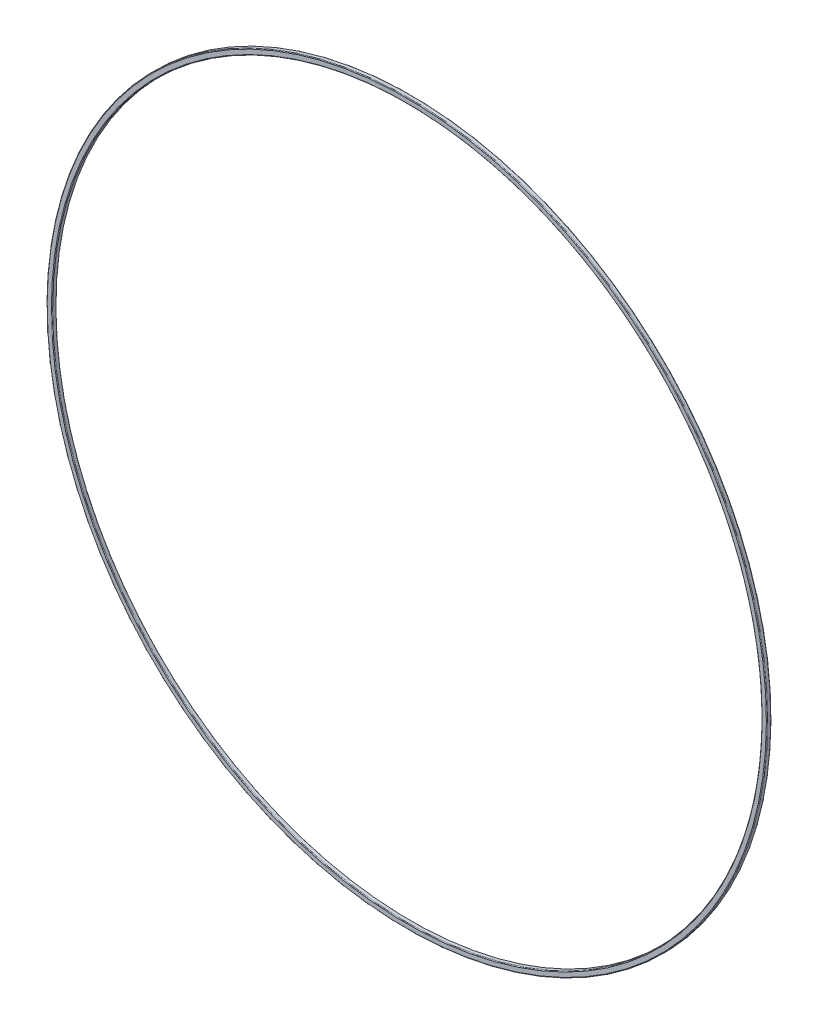
ISO-10303-21;
HEADER;
FILE_DESCRIPTION(('STEP AP214'),'2;1');
FILE_NAME('part.step','',(''),(''),'','','');
FILE_SCHEMA(('AUTOMOTIVE_DESIGN { 1 0 10303 214 1 1 1 1 }'));
ENDSEC;
DATA;
#1=APPLICATION_CONTEXT('core data for automotive mechanical design processes');
#2=APPLICATION_PROTOCOL_DEFINITION('international standard','automotive_design',2000,#1);
#3=PRODUCT_CONTEXT('',#1,'mechanical');
#4=PRODUCT('Part','Part','',(#3));
#5=PRODUCT_RELATED_PRODUCT_CATEGORY('part','',(#4));
#6=PRODUCT_DEFINITION_FORMATION('','',#4);
#7=PRODUCT_DEFINITION_CONTEXT('part definition',#1,'design');
#8=PRODUCT_DEFINITION('design','',#6,#7);
#9=PRODUCT_DEFINITION_SHAPE('','',#8);
#10=(LENGTH_UNIT() NAMED_UNIT(*) SI_UNIT(.MILLI.,.METRE.));
#11=(NAMED_UNIT(*) PLANE_ANGLE_UNIT() SI_UNIT($,.RADIAN.));
#12=(NAMED_UNIT(*) SI_UNIT($,.STERADIAN.) SOLID_ANGLE_UNIT());
#13=UNCERTAINTY_MEASURE_WITH_UNIT(LENGTH_MEASURE(1.E-05),#10,'distance_accuracy_value','');
#14=(GEOMETRIC_REPRESENTATION_CONTEXT(3) GLOBAL_UNCERTAINTY_ASSIGNED_CONTEXT((#13)) GLOBAL_UNIT_ASSIGNED_CONTEXT((#10,
#11,#12)) REPRESENTATION_CONTEXT('',''));
#15=CARTESIAN_POINT('',(0.,0.,0.));
#16=DIRECTION('',(0.,0.,1.));
#17=DIRECTION('',(1.,0.,0.));
#18=AXIS2_PLACEMENT_3D('',#15,#16,#17);
#19=CARTESIAN_POINT('',(0.,0.,0.6));
#20=DIRECTION('',(0.,0.,1.));
#21=DIRECTION('',(-0.999990246772435,0.00441660050317515,0.));
#22=AXIS2_PLACEMENT_3D('',#19,#20,#21);
#23=TOROIDAL_SURFACE('',#22,322.6,0.6);
#24=CARTESIAN_POINT('',(0.,0.,0.));
#25=DIRECTION('',(0.,0.,1.));
#26=DIRECTION('',(-1.,0.,0.));
#27=AXIS2_PLACEMENT_3D('',#24,#25,#26);
#28=CIRCLE('',#27,322.6);
#29=CARTESIAN_POINT('',(322.596853608788,-1.42479532232427,0.));
#30=VERTEX_POINT('',#29);
#31=EDGE_CURVE('E128',#30,#30,#28,.T.);
#32=ORIENTED_EDGE('',*,*,#31,.F.);
#33=CARTESIAN_POINT('',(322.596853608788,-1.42479532232427,0.6));
#34=DIRECTION('',(0.00441660050317503,0.999990246772435,0.));
#35=DIRECTION('',(0.999990246772435,-0.00441660050317503,0.));
#36=AXIS2_PLACEMENT_3D('',#33,#34,#35);
#37=CIRCLE('',#36,0.6);
#38=CARTESIAN_POINT('',(321.996859460724,-1.42214536202236,0.6));
#39=VERTEX_POINT('',#38);
#40=EDGE_CURVE('E11',#30,#39,#37,.T.);
#41=ORIENTED_EDGE('',*,*,#40,.T.);
#42=CARTESIAN_POINT('',(0.,0.,0.6));
#43=DIRECTION('',(0.,0.,1.));
#44=DIRECTION('',(1.,0.,0.));
#45=AXIS2_PLACEMENT_3D('',#42,#43,#44);
#46=CIRCLE('',#45,322.);
#47=CARTESIAN_POINT('',(-322.,0.,0.6));
#48=VERTEX_POINT('',#47);
#49=EDGE_CURVE('E110',#39,#48,#46,.T.);
#50=ORIENTED_EDGE('',*,*,#49,.T.);
#51=CARTESIAN_POINT('',(0.,0.,0.6));
#52=DIRECTION('',(0.,0.,1.));
#53=DIRECTION('',(1.,0.,0.));
#54=AXIS2_PLACEMENT_3D('',#51,#52,#53);
#55=CIRCLE('',#54,322.);
#56=EDGE_CURVE('E114',#48,#39,#55,.T.);
#57=ORIENTED_EDGE('',*,*,#56,.T.);
#58=ORIENTED_EDGE('',*,*,#40,.F.);
#59=EDGE_LOOP('',(#32,#41,#50,#57,#58));
#60=FACE_BOUND('',#59,.T.);
#61=ADVANCED_FACE('F17',(#60),#23,.T.);
#62=CARTESIAN_POINT('',(0.,0.,0.));
#63=DIRECTION('',(0.,0.,1.));
#64=DIRECTION('',(1.,0.,0.));
#65=AXIS2_PLACEMENT_3D('',#62,#63,#64);
#66=CYLINDRICAL_SURFACE('',#65,322.);
#67=ORIENTED_EDGE('',*,*,#49,.F.);
#68=ORIENTED_EDGE('',*,*,#56,.F.);
#69=DIRECTION('',(0.,0.,1.));
#70=VECTOR('',#69,1.);
#71=CARTESIAN_POINT('',(-322.,0.,0.));
#72=LINE('',#71,#70);
#73=CARTESIAN_POINT('',(-322.,0.,3.4));
#74=VERTEX_POINT('',#73);
#75=EDGE_CURVE('E28',#48,#74,#72,.T.);
#76=ORIENTED_EDGE('',*,*,#75,.T.);
#77=CARTESIAN_POINT('',(0.,0.,3.4));
#78=DIRECTION('',(0.,0.,-1.));
#79=DIRECTION('',(1.,0.,0.));
#80=AXIS2_PLACEMENT_3D('',#77,#78,#79);
#81=CIRCLE('',#80,322.);
#82=CARTESIAN_POINT('',(-321.993662470275,-2.02022993210752,3.4));
#83=VERTEX_POINT('',#82);
#84=EDGE_CURVE('E21',#83,#74,#81,.T.);
#85=ORIENTED_EDGE('',*,*,#84,.F.);
#86=CARTESIAN_POINT('',(0.,0.,3.4));
#87=DIRECTION('',(0.,0.,-1.));
#88=DIRECTION('',(1.,0.,0.));
#89=AXIS2_PLACEMENT_3D('',#86,#87,#88);
#90=CIRCLE('',#89,322.);
#91=EDGE_CURVE('E116',#74,#83,#90,.T.);
#92=ORIENTED_EDGE('',*,*,#91,.F.);
#93=ORIENTED_EDGE('',*,*,#75,.F.);
#94=EDGE_LOOP('',(#67,#68,#76,#85,#92,#93));
#95=FACE_BOUND('',#94,.T.);
#96=ADVANCED_FACE('F19',(#95),#66,.F.);
#97=CARTESIAN_POINT('',(0.,0.,3.4));
#98=DIRECTION('',(0.,0.,1.));
#99=DIRECTION('',(0.999980318230668,0.0062740060003338,0.));
#100=AXIS2_PLACEMENT_3D('',#97,#98,#99);
#101=TOROIDAL_SURFACE('',#100,322.6,0.6);
#102=ORIENTED_EDGE('',*,*,#91,.T.);
#103=CARTESIAN_POINT('',(-322.593650661214,-2.02399433570772,3.4));
#104=DIRECTION('',(0.00627400600033392,-0.999980318230668,0.));
#105=DIRECTION('',(-0.999980318230668,-0.00627400600033392,0.));
#106=AXIS2_PLACEMENT_3D('',#103,#104,#105);
#107=CIRCLE('',#106,0.6);
#108=CARTESIAN_POINT('',(-322.593650661213,-2.02399433570772,4.));
#109=VERTEX_POINT('',#108);
#110=EDGE_CURVE('E76',#83,#109,#107,.T.);
#111=ORIENTED_EDGE('',*,*,#110,.T.);
#112=CARTESIAN_POINT('',(0.,0.,4.));
#113=DIRECTION('',(0.,0.,-1.));
#114=DIRECTION('',(1.,0.,0.));
#115=AXIS2_PLACEMENT_3D('',#112,#113,#114);
#116=CIRCLE('',#115,322.6);
#117=EDGE_CURVE('E92',#109,#109,#116,.T.);
#118=ORIENTED_EDGE('',*,*,#117,.F.);
#119=ORIENTED_EDGE('',*,*,#110,.F.);
#120=ORIENTED_EDGE('',*,*,#84,.T.);
#121=EDGE_LOOP('',(#102,#111,#118,#119,#120));
#122=FACE_BOUND('',#121,.T.);
#123=ADVANCED_FACE('F229',(#122),#101,.T.);
#124=CARTESIAN_POINT('',(0.,0.,4.));
#125=DIRECTION('',(0.,0.,1.));
#126=DIRECTION('',(1.,0.,0.));
#127=AXIS2_PLACEMENT_3D('',#124,#125,#126);
#128=PLANE('',#127);
#129=ORIENTED_EDGE('',*,*,#117,.T.);
#130=EDGE_LOOP('',(#129));
#131=FACE_BOUND('',#130,.T.);
#132=CARTESIAN_POINT('',(0.,0.,4.));
#133=DIRECTION('',(0.,0.,1.));
#134=DIRECTION('',(1.,0.,0.));
#135=AXIS2_PLACEMENT_3D('',#132,#133,#134);
#136=CIRCLE('',#135,326.4);
#137=CARTESIAN_POINT('',(-326.396913155396,1.41953606104461,4.));
#138=VERTEX_POINT('',#137);
#139=EDGE_CURVE('E87',#138,#138,#136,.T.);
#140=ORIENTED_EDGE('',*,*,#139,.T.);
#141=EDGE_LOOP('',(#140));
#142=FACE_BOUND('',#141,.T.);
#143=ADVANCED_FACE('F95',(#131,#142),#128,.T.);
#144=CARTESIAN_POINT('',(0.,0.,3.4));
#145=DIRECTION('',(0.,0.,1.));
#146=DIRECTION('',(0.999990542755504,-0.00434906881447502,0.));
#147=AXIS2_PLACEMENT_3D('',#144,#145,#146);
#148=TOROIDAL_SURFACE('',#147,326.4,0.6);
#149=ORIENTED_EDGE('',*,*,#139,.F.);
#150=CARTESIAN_POINT('',(-326.396913155396,1.41953606104461,3.4));
#151=DIRECTION('',(-0.00434906881447489,-0.999990542755504,0.));
#152=DIRECTION('',(-0.999990542755504,0.00434906881447489,0.));
#153=AXIS2_PLACEMENT_3D('',#150,#151,#152);
#154=CIRCLE('',#153,0.6);
#155=CARTESIAN_POINT('',(-326.99690748105,1.42214550233329,3.4));
#156=VERTEX_POINT('',#155);
#157=EDGE_CURVE('E84',#138,#156,#154,.T.);
#158=ORIENTED_EDGE('',*,*,#157,.T.);
#159=CARTESIAN_POINT('',(0.,0.,3.4));
#160=DIRECTION('',(0.,0.,1.));
#161=DIRECTION('',(1.,0.,0.));
#162=AXIS2_PLACEMENT_3D('',#159,#160,#161);
#163=CIRCLE('',#162,327.);
#164=CARTESIAN_POINT('',(-327.,0.,3.4));
#165=VERTEX_POINT('',#164);
#166=EDGE_CURVE('E97',#156,#165,#163,.T.);
#167=ORIENTED_EDGE('',*,*,#166,.T.);
#168=CARTESIAN_POINT('',(0.,0.,3.4));
#169=DIRECTION('',(0.,0.,1.));
#170=DIRECTION('',(1.,0.,0.));
#171=AXIS2_PLACEMENT_3D('',#168,#169,#170);
#172=CIRCLE('',#171,327.);
#173=EDGE_CURVE('E89',#165,#156,#172,.T.);
#174=ORIENTED_EDGE('',*,*,#173,.T.);
#175=ORIENTED_EDGE('',*,*,#157,.F.);
#176=EDGE_LOOP('',(#149,#158,#167,#174,#175));
#177=FACE_BOUND('',#176,.T.);
#178=ADVANCED_FACE('F86',(#177),#148,.T.);
#179=CARTESIAN_POINT('',(0.,0.,0.));
#180=DIRECTION('',(0.,0.,1.));
#181=DIRECTION('',(1.,0.,0.));
#182=AXIS2_PLACEMENT_3D('',#179,#180,#181);
#183=CYLINDRICAL_SURFACE('',#182,327.);
#184=ORIENTED_EDGE('',*,*,#173,.F.);
#185=DIRECTION('',(0.,0.,-1.));
#186=VECTOR('',#185,1.);
#187=CARTESIAN_POINT('',(-327.,0.,0.));
#188=LINE('',#187,#186);
#189=CARTESIAN_POINT('',(-327.,0.,0.6));
#190=VERTEX_POINT('',#189);
#191=EDGE_CURVE('E103',#165,#190,#188,.T.);
#192=ORIENTED_EDGE('',*,*,#191,.T.);
#193=CARTESIAN_POINT('',(0.,0.,0.6));
#194=DIRECTION('',(0.,0.,-1.));
#195=DIRECTION('',(1.,0.,0.));
#196=AXIS2_PLACEMENT_3D('',#193,#194,#195);
#197=CIRCLE('',#196,327.);
#198=CARTESIAN_POINT('',(-326.993759373778,-2.02023033432937,0.6));
#199=VERTEX_POINT('',#198);
#200=EDGE_CURVE('E106',#199,#190,#197,.T.);
#201=ORIENTED_EDGE('',*,*,#200,.F.);
#202=CARTESIAN_POINT('',(0.,0.,0.6));
#203=DIRECTION('',(0.,0.,-1.));
#204=DIRECTION('',(1.,0.,0.));
#205=AXIS2_PLACEMENT_3D('',#202,#203,#204);
#206=CIRCLE('',#205,327.);
#207=EDGE_CURVE('E132',#190,#199,#206,.T.);
#208=ORIENTED_EDGE('',*,*,#207,.F.);
#209=ORIENTED_EDGE('',*,*,#191,.F.);
#210=ORIENTED_EDGE('',*,*,#166,.F.);
#211=EDGE_LOOP('',(#184,#192,#201,#208,#209,#210));
#212=FACE_BOUND('',#211,.T.);
#213=ADVANCED_FACE('F159',(#212),#183,.T.);
#214=CARTESIAN_POINT('',(0.,0.,0.6));
#215=DIRECTION('',(0.,0.,1.));
#216=DIRECTION('',(0.999980915516141,0.00617807441690925,0.));
#217=AXIS2_PLACEMENT_3D('',#214,#215,#216);
#218=TOROIDAL_SURFACE('',#217,326.4,0.6);
#219=ORIENTED_EDGE('',*,*,#207,.T.);
#220=CARTESIAN_POINT('',(-326.393770824468,-2.01652348967922,0.6));
#221=DIRECTION('',(0.00617807441690937,-0.999980915516141,0.));
#222=DIRECTION('',(-0.999980915516141,-0.00617807441690937,0.));
#223=AXIS2_PLACEMENT_3D('',#220,#221,#222);
#224=CIRCLE('',#223,0.6);
#225=CARTESIAN_POINT('',(-326.393770824468,-2.01652348967922,0.));
#226=VERTEX_POINT('',#225);
#227=EDGE_CURVE('E134',#199,#226,#224,.T.);
#228=ORIENTED_EDGE('',*,*,#227,.T.);
#229=CARTESIAN_POINT('',(0.,0.,0.));
#230=DIRECTION('',(0.,0.,-1.));
#231=DIRECTION('',(1.,0.,0.));
#232=AXIS2_PLACEMENT_3D('',#229,#230,#231);
#233=CIRCLE('',#232,326.4);
#234=EDGE_CURVE('E133',#226,#226,#233,.T.);
#235=ORIENTED_EDGE('',*,*,#234,.F.);
#236=ORIENTED_EDGE('',*,*,#227,.F.);
#237=ORIENTED_EDGE('',*,*,#200,.T.);
#238=EDGE_LOOP('',(#219,#228,#235,#236,#237));
#239=FACE_BOUND('',#238,.T.);
#240=ADVANCED_FACE('F152',(#239),#218,.T.);
#241=CARTESIAN_POINT('',(0.,0.,0.));
#242=DIRECTION('',(0.,0.,1.));
#243=DIRECTION('',(1.,0.,0.));
#244=AXIS2_PLACEMENT_3D('',#241,#242,#243);
#245=PLANE('',#244);
#246=ORIENTED_EDGE('',*,*,#31,.T.);
#247=EDGE_LOOP('',(#246));
#248=FACE_BOUND('',#247,.T.);
#249=ORIENTED_EDGE('',*,*,#234,.T.);
#250=EDGE_LOOP('',(#249));
#251=FACE_BOUND('',#250,.T.);
#252=ADVANCED_FACE('F176',(#248,#251),#245,.F.);
#253=CLOSED_SHELL('',(#61,#96,#123,#143,#178,#213,#240,#252));
#254=MANIFOLD_SOLID_BREP('B1',#253);
#255=ADVANCED_BREP_SHAPE_REPRESENTATION('',(#18,#254),#14);
#256=SHAPE_DEFINITION_REPRESENTATION(#9,#255);
ENDSEC;
END-ISO-10303-21;
